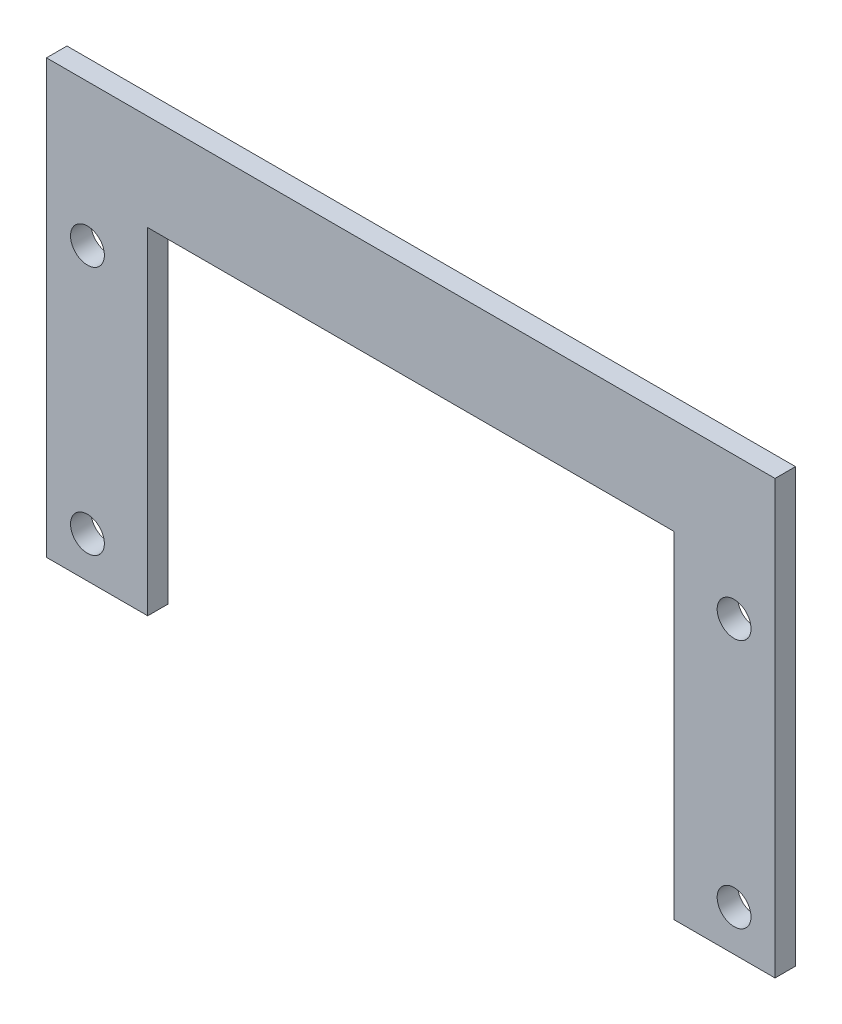
ISO-10303-21;
HEADER;
FILE_DESCRIPTION(('STEP AP214'),'2;1');
FILE_NAME('part.step','',(''),(''),'','','');
FILE_SCHEMA(('AUTOMOTIVE_DESIGN { 1 0 10303 214 1 1 1 1 }'));
ENDSEC;
DATA;
#1=APPLICATION_CONTEXT('core data for automotive mechanical design processes');
#2=APPLICATION_PROTOCOL_DEFINITION('international standard','automotive_design',2000,#1);
#3=PRODUCT_CONTEXT('',#1,'mechanical');
#4=PRODUCT('Part','Part','',(#3));
#5=PRODUCT_RELATED_PRODUCT_CATEGORY('part','',(#4));
#6=PRODUCT_DEFINITION_FORMATION('','',#4);
#7=PRODUCT_DEFINITION_CONTEXT('part definition',#1,'design');
#8=PRODUCT_DEFINITION('design','',#6,#7);
#9=PRODUCT_DEFINITION_SHAPE('','',#8);
#10=(LENGTH_UNIT() NAMED_UNIT(*) SI_UNIT(.MILLI.,.METRE.));
#11=(NAMED_UNIT(*) PLANE_ANGLE_UNIT() SI_UNIT($,.RADIAN.));
#12=(NAMED_UNIT(*) SI_UNIT($,.STERADIAN.) SOLID_ANGLE_UNIT());
#13=UNCERTAINTY_MEASURE_WITH_UNIT(LENGTH_MEASURE(1.E-05),#10,'distance_accuracy_value','');
#14=(GEOMETRIC_REPRESENTATION_CONTEXT(3) GLOBAL_UNCERTAINTY_ASSIGNED_CONTEXT((#13)) GLOBAL_UNIT_ASSIGNED_CONTEXT((#10,
#11,#12)) REPRESENTATION_CONTEXT('',''));
#15=CARTESIAN_POINT('',(0.,0.,0.));
#16=DIRECTION('',(0.,0.,1.));
#17=DIRECTION('',(1.,0.,0.));
#18=AXIS2_PLACEMENT_3D('',#15,#16,#17);
#19=CARTESIAN_POINT('',(0.,0.,3.175));
#20=DIRECTION('',(0.,0.,-1.));
#21=DIRECTION('',(-1.,0.,0.));
#22=AXIS2_PLACEMENT_3D('',#19,#20,#21);
#23=PLANE('',#22);
#24=DIRECTION('',(0.,-1.,0.));
#25=VECTOR('',#24,1.);
#26=CARTESIAN_POINT('',(-8.910000095367,8.69,3.175));
#27=LINE('',#26,#25);
#28=CARTESIAN_POINT('',(-8.910000095367,75.81,3.175));
#29=VERTEX_POINT('',#28);
#30=CARTESIAN_POINT('',(-8.910000095367,8.69,3.175));
#31=VERTEX_POINT('',#30);
#32=EDGE_CURVE('E166',#29,#31,#27,.T.);
#33=ORIENTED_EDGE('',*,*,#32,.T.);
#34=DIRECTION('',(1.,0.,0.));
#35=VECTOR('',#34,1.);
#36=CARTESIAN_POINT('',(-8.910000095367,8.69,3.175));
#37=LINE('',#36,#35);
#38=CARTESIAN_POINT('',(6.78999990463299,8.69,3.175));
#39=VERTEX_POINT('',#38);
#40=EDGE_CURVE('E98',#31,#39,#37,.T.);
#41=ORIENTED_EDGE('',*,*,#40,.T.);
#42=DIRECTION('',(0.,1.,0.));
#43=VECTOR('',#42,1.);
#44=CARTESIAN_POINT('',(6.78999990463299,8.69,3.175));
#45=LINE('',#44,#43);
#46=CARTESIAN_POINT('',(6.78999990463299,60.853549491622,3.175));
#47=VERTEX_POINT('',#46);
#48=EDGE_CURVE('E187',#39,#47,#45,.T.);
#49=ORIENTED_EDGE('',*,*,#48,.T.);
#50=DIRECTION('',(1.,0.,0.));
#51=VECTOR('',#50,1.);
#52=CARTESIAN_POINT('',(6.78999990463299,60.853549491622,3.175));
#53=LINE('',#52,#51);
#54=CARTESIAN_POINT('',(88.409998474121,60.853549491622,3.175));
#55=VERTEX_POINT('',#54);
#56=EDGE_CURVE('E199',#47,#55,#53,.T.);
#57=ORIENTED_EDGE('',*,*,#56,.T.);
#58=DIRECTION('',(0.,-1.,0.));
#59=VECTOR('',#58,1.);
#60=CARTESIAN_POINT('',(88.409998474121,8.69000000000001,3.175));
#61=LINE('',#60,#59);
#62=CARTESIAN_POINT('',(88.409998474121,8.69000000000001,3.175));
#63=VERTEX_POINT('',#62);
#64=EDGE_CURVE('E118',#55,#63,#61,.T.);
#65=ORIENTED_EDGE('',*,*,#64,.T.);
#66=DIRECTION('',(1.,0.,0.));
#67=VECTOR('',#66,1.);
#68=CARTESIAN_POINT('',(104.109998474121,8.69000000000001,3.175));
#69=LINE('',#68,#67);
#70=CARTESIAN_POINT('',(104.109998474121,8.69000000000001,3.175));
#71=VERTEX_POINT('',#70);
#72=EDGE_CURVE('E111',#63,#71,#69,.T.);
#73=ORIENTED_EDGE('',*,*,#72,.T.);
#74=DIRECTION('',(0.,1.,0.));
#75=VECTOR('',#74,1.);
#76=CARTESIAN_POINT('',(104.109998474121,8.69000000000001,3.175));
#77=LINE('',#76,#75);
#78=CARTESIAN_POINT('',(104.109998474121,75.81,3.175));
#79=VERTEX_POINT('',#78);
#80=EDGE_CURVE('E115',#71,#79,#77,.T.);
#81=ORIENTED_EDGE('',*,*,#80,.T.);
#82=DIRECTION('',(-1.,0.,0.));
#83=VECTOR('',#82,1.);
#84=CARTESIAN_POINT('',(104.109998474121,75.81,3.175));
#85=LINE('',#84,#83);
#86=EDGE_CURVE('E57',#79,#29,#85,.T.);
#87=ORIENTED_EDGE('',*,*,#86,.T.);
#88=EDGE_LOOP('',(#33,#41,#49,#57,#65,#73,#81,#87));
#89=FACE_BOUND('',#88,.T.);
#90=CARTESIAN_POINT('',(-2.560000095367,53.76,3.175));
#91=DIRECTION('',(0.,0.,1.));
#92=DIRECTION('',(1.,0.,0.));
#93=AXIS2_PLACEMENT_3D('',#90,#91,#92);
#94=CIRCLE('',#93,2.625);
#95=CARTESIAN_POINT('',(0.0649999046329979,53.76,3.175));
#96=VERTEX_POINT('',#95);
#97=EDGE_CURVE('E147',#96,#96,#94,.T.);
#98=ORIENTED_EDGE('',*,*,#97,.F.);
#99=EDGE_LOOP('',(#98));
#100=FACE_BOUND('',#99,.T.);
#101=CARTESIAN_POINT('',(-2.560000095367,15.04,3.175));
#102=DIRECTION('',(0.,0.,1.));
#103=DIRECTION('',(1.,0.,0.));
#104=AXIS2_PLACEMENT_3D('',#101,#102,#103);
#105=CIRCLE('',#104,2.625);
#106=CARTESIAN_POINT('',(0.0649999046329975,15.04,3.175));
#107=VERTEX_POINT('',#106);
#108=EDGE_CURVE('E213',#107,#107,#105,.T.);
#109=ORIENTED_EDGE('',*,*,#108,.F.);
#110=EDGE_LOOP('',(#109));
#111=FACE_BOUND('',#110,.T.);
#112=CARTESIAN_POINT('',(97.759998474121,15.04,3.175));
#113=DIRECTION('',(0.,0.,1.));
#114=DIRECTION('',(1.,0.,0.));
#115=AXIS2_PLACEMENT_3D('',#112,#113,#114);
#116=CIRCLE('',#115,2.625);
#117=CARTESIAN_POINT('',(100.384998474121,15.04,3.175));
#118=VERTEX_POINT('',#117);
#119=EDGE_CURVE('E221',#118,#118,#116,.T.);
#120=ORIENTED_EDGE('',*,*,#119,.F.);
#121=EDGE_LOOP('',(#120));
#122=FACE_BOUND('',#121,.T.);
#123=CARTESIAN_POINT('',(97.759998474121,53.76,3.175));
#124=DIRECTION('',(0.,0.,1.));
#125=DIRECTION('',(1.,0.,0.));
#126=AXIS2_PLACEMENT_3D('',#123,#124,#125);
#127=CIRCLE('',#126,2.625);
#128=CARTESIAN_POINT('',(100.384998474121,53.76,3.175));
#129=VERTEX_POINT('',#128);
#130=EDGE_CURVE('E229',#129,#129,#127,.T.);
#131=ORIENTED_EDGE('',*,*,#130,.F.);
#132=EDGE_LOOP('',(#131));
#133=FACE_BOUND('',#132,.T.);
#134=ADVANCED_FACE('F39',(#89,#100,#111,#122,#133),#23,.F.);
#135=CARTESIAN_POINT('',(0.,0.,0.));
#136=DIRECTION('',(0.,0.,-1.));
#137=DIRECTION('',(-1.,0.,0.));
#138=AXIS2_PLACEMENT_3D('',#135,#136,#137);
#139=PLANE('',#138);
#140=CARTESIAN_POINT('',(97.759998474121,15.04,0.));
#141=DIRECTION('',(0.,0.,1.));
#142=DIRECTION('',(1.,0.,0.));
#143=AXIS2_PLACEMENT_3D('',#140,#141,#142);
#144=CIRCLE('',#143,2.625);
#145=CARTESIAN_POINT('',(100.384998474121,15.04,0.));
#146=VERTEX_POINT('',#145);
#147=EDGE_CURVE('E225',#146,#146,#144,.T.);
#148=ORIENTED_EDGE('',*,*,#147,.T.);
#149=EDGE_LOOP('',(#148));
#150=FACE_BOUND('',#149,.T.);
#151=CARTESIAN_POINT('',(-2.560000095367,53.76,0.));
#152=DIRECTION('',(0.,0.,1.));
#153=DIRECTION('',(1.,0.,0.));
#154=AXIS2_PLACEMENT_3D('',#151,#152,#153);
#155=CIRCLE('',#154,2.625);
#156=CARTESIAN_POINT('',(0.0649999046329979,53.76,0.));
#157=VERTEX_POINT('',#156);
#158=EDGE_CURVE('E209',#157,#157,#155,.T.);
#159=ORIENTED_EDGE('',*,*,#158,.T.);
#160=EDGE_LOOP('',(#159));
#161=FACE_BOUND('',#160,.T.);
#162=DIRECTION('',(0.,-1.,0.));
#163=VECTOR('',#162,1.);
#164=CARTESIAN_POINT('',(-8.910000095367,8.69,0.));
#165=LINE('',#164,#163);
#166=CARTESIAN_POINT('',(-8.910000095367,75.81,0.));
#167=VERTEX_POINT('',#166);
#168=CARTESIAN_POINT('',(-8.910000095367,8.69,0.));
#169=VERTEX_POINT('',#168);
#170=EDGE_CURVE('E142',#167,#169,#165,.T.);
#171=ORIENTED_EDGE('',*,*,#170,.F.);
#172=DIRECTION('',(-1.,0.,0.));
#173=VECTOR('',#172,1.);
#174=CARTESIAN_POINT('',(-8.910000095367,75.81,0.));
#175=LINE('',#174,#173);
#176=CARTESIAN_POINT('',(104.109998474121,75.81,0.));
#177=VERTEX_POINT('',#176);
#178=EDGE_CURVE('E86',#177,#167,#175,.T.);
#179=ORIENTED_EDGE('',*,*,#178,.F.);
#180=DIRECTION('',(0.,1.,0.));
#181=VECTOR('',#180,1.);
#182=CARTESIAN_POINT('',(104.109998474121,8.69000000000001,0.));
#183=LINE('',#182,#181);
#184=CARTESIAN_POINT('',(104.109998474121,8.69000000000001,0.));
#185=VERTEX_POINT('',#184);
#186=EDGE_CURVE('E161',#185,#177,#183,.T.);
#187=ORIENTED_EDGE('',*,*,#186,.F.);
#188=DIRECTION('',(1.,0.,0.));
#189=VECTOR('',#188,1.);
#190=CARTESIAN_POINT('',(104.109998474121,8.69000000000001,0.));
#191=LINE('',#190,#189);
#192=CARTESIAN_POINT('',(88.409998474121,8.69000000000001,0.));
#193=VERTEX_POINT('',#192);
#194=EDGE_CURVE('E128',#193,#185,#191,.T.);
#195=ORIENTED_EDGE('',*,*,#194,.F.);
#196=DIRECTION('',(0.,-1.,0.));
#197=VECTOR('',#196,1.);
#198=CARTESIAN_POINT('',(88.409998474121,8.69000000000001,0.));
#199=LINE('',#198,#197);
#200=CARTESIAN_POINT('',(88.409998474121,60.853549491622,0.));
#201=VERTEX_POINT('',#200);
#202=EDGE_CURVE('E156',#201,#193,#199,.T.);
#203=ORIENTED_EDGE('',*,*,#202,.F.);
#204=DIRECTION('',(1.,0.,0.));
#205=VECTOR('',#204,1.);
#206=CARTESIAN_POINT('',(6.78999990463299,60.853549491622,0.));
#207=LINE('',#206,#205);
#208=CARTESIAN_POINT('',(6.78999990463299,60.853549491622,0.));
#209=VERTEX_POINT('',#208);
#210=EDGE_CURVE('E153',#209,#201,#207,.T.);
#211=ORIENTED_EDGE('',*,*,#210,.F.);
#212=DIRECTION('',(0.,1.,0.));
#213=VECTOR('',#212,1.);
#214=CARTESIAN_POINT('',(6.78999990463299,8.69,0.));
#215=LINE('',#214,#213);
#216=CARTESIAN_POINT('',(6.78999990463299,8.69,0.));
#217=VERTEX_POINT('',#216);
#218=EDGE_CURVE('E150',#217,#209,#215,.T.);
#219=ORIENTED_EDGE('',*,*,#218,.F.);
#220=DIRECTION('',(1.,0.,0.));
#221=VECTOR('',#220,1.);
#222=CARTESIAN_POINT('',(-8.910000095367,8.69,0.));
#223=LINE('',#222,#221);
#224=EDGE_CURVE('E146',#169,#217,#223,.T.);
#225=ORIENTED_EDGE('',*,*,#224,.F.);
#226=EDGE_LOOP('',(#171,#179,#187,#195,#203,#211,#219,#225));
#227=FACE_BOUND('',#226,.T.);
#228=CARTESIAN_POINT('',(-2.560000095367,15.04,0.));
#229=DIRECTION('',(0.,0.,1.));
#230=DIRECTION('',(1.,0.,0.));
#231=AXIS2_PLACEMENT_3D('',#228,#229,#230);
#232=CIRCLE('',#231,2.625);
#233=CARTESIAN_POINT('',(0.0649999046329975,15.04,0.));
#234=VERTEX_POINT('',#233);
#235=EDGE_CURVE('E217',#234,#234,#232,.T.);
#236=ORIENTED_EDGE('',*,*,#235,.T.);
#237=EDGE_LOOP('',(#236));
#238=FACE_BOUND('',#237,.T.);
#239=CARTESIAN_POINT('',(97.759998474121,53.76,0.));
#240=DIRECTION('',(0.,0.,1.));
#241=DIRECTION('',(1.,0.,0.));
#242=AXIS2_PLACEMENT_3D('',#239,#240,#241);
#243=CIRCLE('',#242,2.625);
#244=CARTESIAN_POINT('',(100.384998474121,53.76,0.));
#245=VERTEX_POINT('',#244);
#246=EDGE_CURVE('E233',#245,#245,#243,.T.);
#247=ORIENTED_EDGE('',*,*,#246,.T.);
#248=EDGE_LOOP('',(#247));
#249=FACE_BOUND('',#248,.T.);
#250=ADVANCED_FACE('F189',(#150,#161,#227,#238,#249),#139,.T.);
#251=CARTESIAN_POINT('',(-8.910000095367,8.69,3.175));
#252=DIRECTION('',(1.,0.,0.));
#253=DIRECTION('',(0.,0.,-1.));
#254=AXIS2_PLACEMENT_3D('',#251,#252,#253);
#255=PLANE('',#254);
#256=ORIENTED_EDGE('',*,*,#170,.T.);
#257=DIRECTION('',(0.,0.,-1.));
#258=VECTOR('',#257,1.);
#259=CARTESIAN_POINT('',(-8.910000095367,8.69,3.175));
#260=LINE('',#259,#258);
#261=EDGE_CURVE('E11',#31,#169,#260,.T.);
#262=ORIENTED_EDGE('',*,*,#261,.F.);
#263=ORIENTED_EDGE('',*,*,#32,.F.);
#264=DIRECTION('',(0.,0.,-1.));
#265=VECTOR('',#264,1.);
#266=CARTESIAN_POINT('',(-8.910000095367,75.81,3.175));
#267=LINE('',#266,#265);
#268=EDGE_CURVE('E138',#29,#167,#267,.T.);
#269=ORIENTED_EDGE('',*,*,#268,.T.);
#270=EDGE_LOOP('',(#256,#262,#263,#269));
#271=FACE_BOUND('',#270,.T.);
#272=ADVANCED_FACE('F41',(#271),#255,.F.);
#273=CARTESIAN_POINT('',(-8.910000095367,8.69,3.175));
#274=DIRECTION('',(0.,1.,0.));
#275=DIRECTION('',(0.,0.,1.));
#276=AXIS2_PLACEMENT_3D('',#273,#274,#275);
#277=PLANE('',#276);
#278=ORIENTED_EDGE('',*,*,#224,.T.);
#279=DIRECTION('',(0.,0.,-1.));
#280=VECTOR('',#279,1.);
#281=CARTESIAN_POINT('',(6.78999990463299,8.69,3.175));
#282=LINE('',#281,#280);
#283=EDGE_CURVE('E49',#39,#217,#282,.T.);
#284=ORIENTED_EDGE('',*,*,#283,.F.);
#285=ORIENTED_EDGE('',*,*,#40,.F.);
#286=ORIENTED_EDGE('',*,*,#261,.T.);
#287=EDGE_LOOP('',(#278,#284,#285,#286));
#288=FACE_BOUND('',#287,.T.);
#289=ADVANCED_FACE('F267',(#288),#277,.F.);
#290=CARTESIAN_POINT('',(6.78999990463299,8.69,3.175));
#291=DIRECTION('',(-1.,0.,0.));
#292=DIRECTION('',(0.,0.,1.));
#293=AXIS2_PLACEMENT_3D('',#290,#291,#292);
#294=PLANE('',#293);
#295=ORIENTED_EDGE('',*,*,#218,.T.);
#296=DIRECTION('',(0.,0.,-1.));
#297=VECTOR('',#296,1.);
#298=CARTESIAN_POINT('',(6.78999990463299,60.853549491622,3.175));
#299=LINE('',#298,#297);
#300=EDGE_CURVE('E177',#47,#209,#299,.T.);
#301=ORIENTED_EDGE('',*,*,#300,.F.);
#302=ORIENTED_EDGE('',*,*,#48,.F.);
#303=ORIENTED_EDGE('',*,*,#283,.T.);
#304=EDGE_LOOP('',(#295,#301,#302,#303));
#305=FACE_BOUND('',#304,.T.);
#306=ADVANCED_FACE('F185',(#305),#294,.F.);
#307=CARTESIAN_POINT('',(6.78999990463299,60.853549491622,3.175));
#308=DIRECTION('',(0.,1.,0.));
#309=DIRECTION('',(0.,0.,1.));
#310=AXIS2_PLACEMENT_3D('',#307,#308,#309);
#311=PLANE('',#310);
#312=ORIENTED_EDGE('',*,*,#210,.T.);
#313=DIRECTION('',(0.,0.,-1.));
#314=VECTOR('',#313,1.);
#315=CARTESIAN_POINT('',(88.409998474121,60.853549491622,3.175));
#316=LINE('',#315,#314);
#317=EDGE_CURVE('E173',#55,#201,#316,.T.);
#318=ORIENTED_EDGE('',*,*,#317,.F.);
#319=ORIENTED_EDGE('',*,*,#56,.F.);
#320=ORIENTED_EDGE('',*,*,#300,.T.);
#321=EDGE_LOOP('',(#312,#318,#319,#320));
#322=FACE_BOUND('',#321,.T.);
#323=ADVANCED_FACE('F194',(#322),#311,.F.);
#324=CARTESIAN_POINT('',(88.409998474121,8.69000000000001,3.175));
#325=DIRECTION('',(1.,0.,0.));
#326=DIRECTION('',(0.,0.,-1.));
#327=AXIS2_PLACEMENT_3D('',#324,#325,#326);
#328=PLANE('',#327);
#329=ORIENTED_EDGE('',*,*,#202,.T.);
#330=DIRECTION('',(0.,0.,-1.));
#331=VECTOR('',#330,1.);
#332=CARTESIAN_POINT('',(88.409998474121,8.69000000000001,3.175));
#333=LINE('',#332,#331);
#334=EDGE_CURVE('E131',#63,#193,#333,.T.);
#335=ORIENTED_EDGE('',*,*,#334,.F.);
#336=ORIENTED_EDGE('',*,*,#64,.F.);
#337=ORIENTED_EDGE('',*,*,#317,.T.);
#338=EDGE_LOOP('',(#329,#335,#336,#337));
#339=FACE_BOUND('',#338,.T.);
#340=ADVANCED_FACE('F197',(#339),#328,.F.);
#341=CARTESIAN_POINT('',(104.109998474121,8.69000000000001,3.175));
#342=DIRECTION('',(0.,1.,0.));
#343=DIRECTION('',(0.,0.,1.));
#344=AXIS2_PLACEMENT_3D('',#341,#342,#343);
#345=PLANE('',#344);
#346=ORIENTED_EDGE('',*,*,#194,.T.);
#347=DIRECTION('',(0.,0.,-1.));
#348=VECTOR('',#347,1.);
#349=CARTESIAN_POINT('',(104.109998474121,8.69000000000001,3.175));
#350=LINE('',#349,#348);
#351=EDGE_CURVE('E125',#71,#185,#350,.T.);
#352=ORIENTED_EDGE('',*,*,#351,.F.);
#353=ORIENTED_EDGE('',*,*,#72,.F.);
#354=ORIENTED_EDGE('',*,*,#334,.T.);
#355=EDGE_LOOP('',(#346,#352,#353,#354));
#356=FACE_BOUND('',#355,.T.);
#357=ADVANCED_FACE('F126',(#356),#345,.F.);
#358=CARTESIAN_POINT('',(104.109998474121,8.69000000000001,3.175));
#359=DIRECTION('',(-1.,0.,0.));
#360=DIRECTION('',(0.,0.,1.));
#361=AXIS2_PLACEMENT_3D('',#358,#359,#360);
#362=PLANE('',#361);
#363=ORIENTED_EDGE('',*,*,#186,.T.);
#364=DIRECTION('',(0.,0.,-1.));
#365=VECTOR('',#364,1.);
#366=CARTESIAN_POINT('',(104.109998474121,75.81,3.175));
#367=LINE('',#366,#365);
#368=EDGE_CURVE('E132',#79,#177,#367,.T.);
#369=ORIENTED_EDGE('',*,*,#368,.F.);
#370=ORIENTED_EDGE('',*,*,#80,.F.);
#371=ORIENTED_EDGE('',*,*,#351,.T.);
#372=EDGE_LOOP('',(#363,#369,#370,#371));
#373=FACE_BOUND('',#372,.T.);
#374=ADVANCED_FACE('F134',(#373),#362,.F.);
#375=CARTESIAN_POINT('',(-8.910000095367,75.81,3.175));
#376=DIRECTION('',(0.,-1.,0.));
#377=DIRECTION('',(0.,0.,-1.));
#378=AXIS2_PLACEMENT_3D('',#375,#376,#377);
#379=PLANE('',#378);
#380=ORIENTED_EDGE('',*,*,#178,.T.);
#381=ORIENTED_EDGE('',*,*,#268,.F.);
#382=ORIENTED_EDGE('',*,*,#86,.F.);
#383=ORIENTED_EDGE('',*,*,#368,.T.);
#384=EDGE_LOOP('',(#380,#381,#382,#383));
#385=FACE_BOUND('',#384,.T.);
#386=ADVANCED_FACE('F255',(#385),#379,.F.);
#387=CARTESIAN_POINT('',(-2.560000095367,53.76,3.175));
#388=DIRECTION('',(0.,0.,-1.));
#389=DIRECTION('',(-1.,0.,0.));
#390=AXIS2_PLACEMENT_3D('',#387,#388,#389);
#391=CYLINDRICAL_SURFACE('',#390,2.625);
#392=ORIENTED_EDGE('',*,*,#97,.T.);
#393=EDGE_LOOP('',(#392));
#394=FACE_BOUND('',#393,.T.);
#395=ORIENTED_EDGE('',*,*,#158,.F.);
#396=EDGE_LOOP('',(#395));
#397=FACE_BOUND('',#396,.T.);
#398=ADVANCED_FACE('F252',(#394,#397),#391,.F.);
#399=CARTESIAN_POINT('',(-2.560000095367,15.04,3.175));
#400=DIRECTION('',(0.,0.,-1.));
#401=DIRECTION('',(-1.,0.,0.));
#402=AXIS2_PLACEMENT_3D('',#399,#400,#401);
#403=CYLINDRICAL_SURFACE('',#402,2.625);
#404=ORIENTED_EDGE('',*,*,#108,.T.);
#405=EDGE_LOOP('',(#404));
#406=FACE_BOUND('',#405,.T.);
#407=ORIENTED_EDGE('',*,*,#235,.F.);
#408=EDGE_LOOP('',(#407));
#409=FACE_BOUND('',#408,.T.);
#410=ADVANCED_FACE('F337',(#406,#409),#403,.F.);
#411=CARTESIAN_POINT('',(97.759998474121,15.04,3.175));
#412=DIRECTION('',(0.,0.,-1.));
#413=DIRECTION('',(-1.,0.,0.));
#414=AXIS2_PLACEMENT_3D('',#411,#412,#413);
#415=CYLINDRICAL_SURFACE('',#414,2.625);
#416=ORIENTED_EDGE('',*,*,#119,.T.);
#417=EDGE_LOOP('',(#416));
#418=FACE_BOUND('',#417,.T.);
#419=ORIENTED_EDGE('',*,*,#147,.F.);
#420=EDGE_LOOP('',(#419));
#421=FACE_BOUND('',#420,.T.);
#422=ADVANCED_FACE('F345',(#418,#421),#415,.F.);
#423=CARTESIAN_POINT('',(97.759998474121,53.76,3.175));
#424=DIRECTION('',(0.,0.,-1.));
#425=DIRECTION('',(-1.,0.,0.));
#426=AXIS2_PLACEMENT_3D('',#423,#424,#425);
#427=CYLINDRICAL_SURFACE('',#426,2.625);
#428=ORIENTED_EDGE('',*,*,#130,.T.);
#429=EDGE_LOOP('',(#428));
#430=FACE_BOUND('',#429,.T.);
#431=ORIENTED_EDGE('',*,*,#246,.F.);
#432=EDGE_LOOP('',(#431));
#433=FACE_BOUND('',#432,.T.);
#434=ADVANCED_FACE('F241',(#430,#433),#427,.F.);
#435=CLOSED_SHELL('',(#134,#250,#272,#289,#306,#323,#340,#357,#374,#386,#398,#410,#422,#434));
#436=MANIFOLD_SOLID_BREP('B2',#435);
#437=ADVANCED_BREP_SHAPE_REPRESENTATION('',(#18,#436),#14);
#438=SHAPE_DEFINITION_REPRESENTATION(#9,#437);
ENDSEC;
END-ISO-10303-21;
